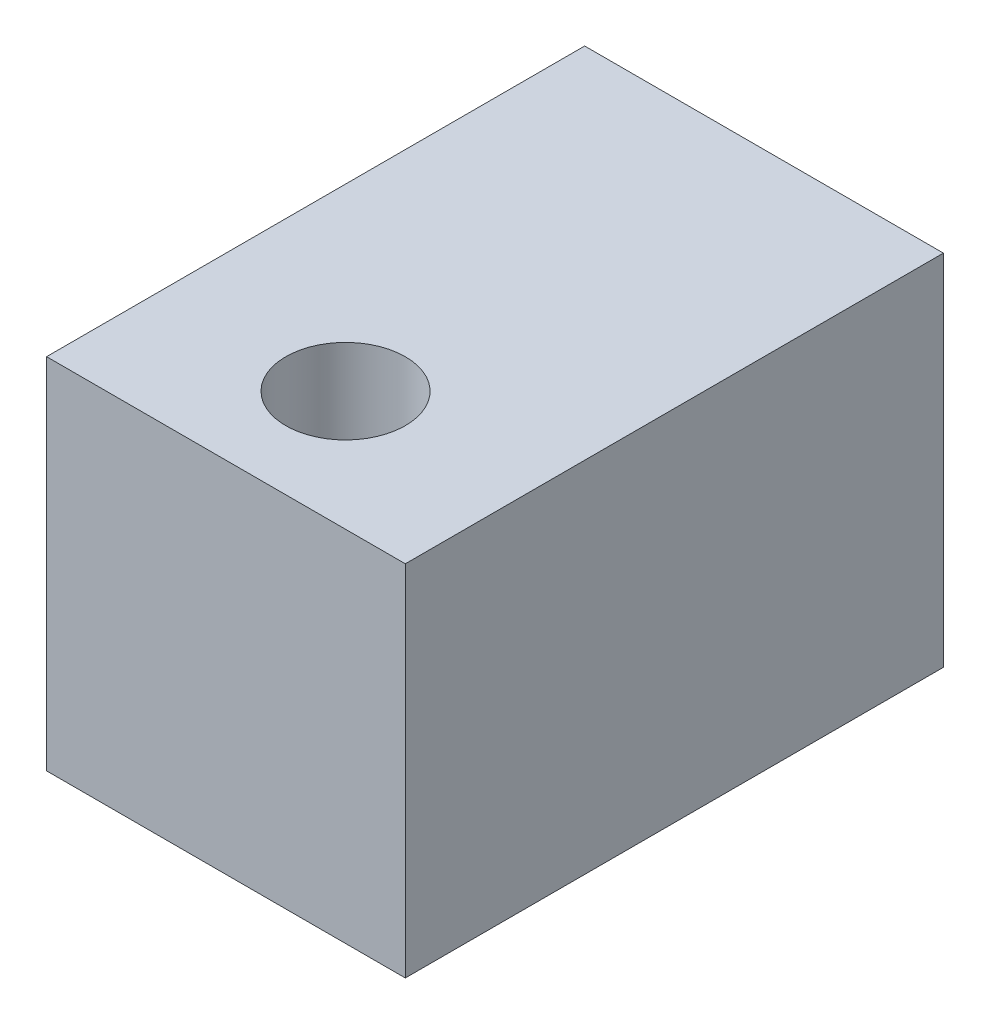
ISO-10303-21;
HEADER;
FILE_DESCRIPTION(('STEP AP214'),'2;1');
FILE_NAME('part.step','',(''),(''),'','','');
FILE_SCHEMA(('AUTOMOTIVE_DESIGN { 1 0 10303 214 1 1 1 1 }'));
ENDSEC;
DATA;
#1=APPLICATION_CONTEXT('core data for automotive mechanical design processes');
#2=APPLICATION_PROTOCOL_DEFINITION('international standard','automotive_design',2000,#1);
#3=PRODUCT_CONTEXT('',#1,'mechanical');
#4=PRODUCT('Part','Part','',(#3));
#5=PRODUCT_RELATED_PRODUCT_CATEGORY('part','',(#4));
#6=PRODUCT_DEFINITION_FORMATION('','',#4);
#7=PRODUCT_DEFINITION_CONTEXT('part definition',#1,'design');
#8=PRODUCT_DEFINITION('design','',#6,#7);
#9=PRODUCT_DEFINITION_SHAPE('','',#8);
#10=(LENGTH_UNIT() NAMED_UNIT(*) SI_UNIT(.MILLI.,.METRE.));
#11=(NAMED_UNIT(*) PLANE_ANGLE_UNIT() SI_UNIT($,.RADIAN.));
#12=(NAMED_UNIT(*) SI_UNIT($,.STERADIAN.) SOLID_ANGLE_UNIT());
#13=UNCERTAINTY_MEASURE_WITH_UNIT(LENGTH_MEASURE(1.E-05),#10,'distance_accuracy_value','');
#14=(GEOMETRIC_REPRESENTATION_CONTEXT(3) GLOBAL_UNCERTAINTY_ASSIGNED_CONTEXT((#13)) GLOBAL_UNIT_ASSIGNED_CONTEXT((#10,
#11,#12)) REPRESENTATION_CONTEXT('',''));
#15=CARTESIAN_POINT('',(0.,0.,0.));
#16=DIRECTION('',(0.,0.,1.));
#17=DIRECTION('',(1.,0.,0.));
#18=AXIS2_PLACEMENT_3D('',#15,#16,#17);
#19=CARTESIAN_POINT('',(0.,0.,0.));
#20=DIRECTION('',(0.,0.,-1.));
#21=DIRECTION('',(-1.,0.,0.));
#22=AXIS2_PLACEMENT_3D('',#19,#20,#21);
#23=PLANE('',#22);
#24=DIRECTION('',(0.,-1.,0.));
#25=VECTOR('',#24,1.);
#26=CARTESIAN_POINT('',(0.,0.,0.));
#27=LINE('',#26,#25);
#28=CARTESIAN_POINT('',(0.,12.,0.));
#29=VERTEX_POINT('',#28);
#30=CARTESIAN_POINT('',(0.,0.,0.));
#31=VERTEX_POINT('',#30);
#32=EDGE_CURVE('E112',#29,#31,#27,.T.);
#33=ORIENTED_EDGE('',*,*,#32,.F.);
#34=DIRECTION('',(-1.,0.,0.));
#35=VECTOR('',#34,1.);
#36=CARTESIAN_POINT('',(0.,12.,0.));
#37=LINE('',#36,#35);
#38=CARTESIAN_POINT('',(12.,12.,0.));
#39=VERTEX_POINT('',#38);
#40=EDGE_CURVE('E63',#39,#29,#37,.T.);
#41=ORIENTED_EDGE('',*,*,#40,.F.);
#42=DIRECTION('',(0.,1.,0.));
#43=VECTOR('',#42,1.);
#44=CARTESIAN_POINT('',(12.,0.,0.));
#45=LINE('',#44,#43);
#46=CARTESIAN_POINT('',(12.,0.,0.));
#47=VERTEX_POINT('',#46);
#48=EDGE_CURVE('E188',#47,#39,#45,.T.);
#49=ORIENTED_EDGE('',*,*,#48,.F.);
#50=DIRECTION('',(1.,0.,0.));
#51=VECTOR('',#50,1.);
#52=CARTESIAN_POINT('',(0.,0.,0.));
#53=LINE('',#52,#51);
#54=EDGE_CURVE('E185',#31,#47,#53,.T.);
#55=ORIENTED_EDGE('',*,*,#54,.F.);
#56=EDGE_LOOP('',(#33,#41,#49,#55));
#57=FACE_BOUND('',#56,.T.);
#58=DIRECTION('',(-1.,0.,0.));
#59=VECTOR('',#58,1.);
#60=CARTESIAN_POINT('',(1.,11.,0.));
#61=LINE('',#60,#59);
#62=CARTESIAN_POINT('',(11.,11.,0.));
#63=VERTEX_POINT('',#62);
#64=CARTESIAN_POINT('',(1.,11.,0.));
#65=VERTEX_POINT('',#64);
#66=EDGE_CURVE('E146',#63,#65,#61,.T.);
#67=ORIENTED_EDGE('',*,*,#66,.T.);
#68=DIRECTION('',(0.,-1.,0.));
#69=VECTOR('',#68,1.);
#70=CARTESIAN_POINT('',(1.,1.,0.));
#71=LINE('',#70,#69);
#72=CARTESIAN_POINT('',(1.,1.,0.));
#73=VERTEX_POINT('',#72);
#74=EDGE_CURVE('E55',#65,#73,#71,.T.);
#75=ORIENTED_EDGE('',*,*,#74,.T.);
#76=DIRECTION('',(1.,0.,0.));
#77=VECTOR('',#76,1.);
#78=CARTESIAN_POINT('',(1.,1.,0.));
#79=LINE('',#78,#77);
#80=CARTESIAN_POINT('',(11.,1.,0.));
#81=VERTEX_POINT('',#80);
#82=EDGE_CURVE('E161',#73,#81,#79,.T.);
#83=ORIENTED_EDGE('',*,*,#82,.T.);
#84=DIRECTION('',(0.,1.,0.));
#85=VECTOR('',#84,1.);
#86=CARTESIAN_POINT('',(11.,1.,0.));
#87=LINE('',#86,#85);
#88=EDGE_CURVE('E165',#81,#63,#87,.T.);
#89=ORIENTED_EDGE('',*,*,#88,.T.);
#90=EDGE_LOOP('',(#67,#75,#83,#89));
#91=FACE_BOUND('',#90,.T.);
#92=ADVANCED_FACE('F39',(#57,#91),#23,.T.);
#93=CARTESIAN_POINT('',(0.,0.,10.));
#94=DIRECTION('',(1.,0.,0.));
#95=DIRECTION('',(0.,0.,-1.));
#96=AXIS2_PLACEMENT_3D('',#93,#94,#95);
#97=PLANE('',#96);
#98=ORIENTED_EDGE('',*,*,#32,.T.);
#99=DIRECTION('',(0.,0.,-1.));
#100=VECTOR('',#99,1.);
#101=CARTESIAN_POINT('',(0.,0.,10.));
#102=LINE('',#101,#100);
#103=CARTESIAN_POINT('',(0.,0.,18.));
#104=VERTEX_POINT('',#103);
#105=EDGE_CURVE('E11',#104,#31,#102,.T.);
#106=ORIENTED_EDGE('',*,*,#105,.F.);
#107=DIRECTION('',(0.,-1.,0.));
#108=VECTOR('',#107,1.);
#109=CARTESIAN_POINT('',(0.,12.,18.));
#110=LINE('',#109,#108);
#111=CARTESIAN_POINT('',(0.,12.,18.));
#112=VERTEX_POINT('',#111);
#113=EDGE_CURVE('E110',#112,#104,#110,.T.);
#114=ORIENTED_EDGE('',*,*,#113,.F.);
#115=DIRECTION('',(0.,0.,-1.));
#116=VECTOR('',#115,1.);
#117=CARTESIAN_POINT('',(0.,12.,10.));
#118=LINE('',#117,#116);
#119=EDGE_CURVE('E193',#112,#29,#118,.T.);
#120=ORIENTED_EDGE('',*,*,#119,.T.);
#121=EDGE_LOOP('',(#98,#106,#114,#120));
#122=FACE_BOUND('',#121,.T.);
#123=ADVANCED_FACE('F41',(#122),#97,.F.);
#124=CARTESIAN_POINT('',(0.,0.,10.));
#125=DIRECTION('',(0.,1.,0.));
#126=DIRECTION('',(0.,0.,1.));
#127=AXIS2_PLACEMENT_3D('',#124,#125,#126);
#128=PLANE('',#127);
#129=CARTESIAN_POINT('',(6.,0.,14.));
#130=DIRECTION('',(0.,-1.,0.));
#131=DIRECTION('',(0.,0.,-1.));
#132=AXIS2_PLACEMENT_3D('',#129,#130,#131);
#133=CIRCLE('',#132,2.);
#134=CARTESIAN_POINT('',(6.,0.,12.));
#135=VERTEX_POINT('',#134);
#136=EDGE_CURVE('E133',#135,#135,#133,.T.);
#137=ORIENTED_EDGE('',*,*,#136,.F.);
#138=EDGE_LOOP('',(#137));
#139=FACE_BOUND('',#138,.T.);
#140=ORIENTED_EDGE('',*,*,#54,.T.);
#141=DIRECTION('',(0.,0.,-1.));
#142=VECTOR('',#141,1.);
#143=CARTESIAN_POINT('',(12.,0.,10.));
#144=LINE('',#143,#142);
#145=CARTESIAN_POINT('',(12.,0.,18.));
#146=VERTEX_POINT('',#145);
#147=EDGE_CURVE('E48',#146,#47,#144,.T.);
#148=ORIENTED_EDGE('',*,*,#147,.F.);
#149=DIRECTION('',(1.,0.,0.));
#150=VECTOR('',#149,1.);
#151=CARTESIAN_POINT('',(0.,0.,18.));
#152=LINE('',#151,#150);
#153=EDGE_CURVE('E115',#104,#146,#152,.T.);
#154=ORIENTED_EDGE('',*,*,#153,.F.);
#155=ORIENTED_EDGE('',*,*,#105,.T.);
#156=EDGE_LOOP('',(#140,#148,#154,#155));
#157=FACE_BOUND('',#156,.T.);
#158=ADVANCED_FACE('F116',(#139,#157),#128,.F.);
#159=CARTESIAN_POINT('',(12.,0.,10.));
#160=DIRECTION('',(-1.,0.,0.));
#161=DIRECTION('',(0.,0.,1.));
#162=AXIS2_PLACEMENT_3D('',#159,#160,#161);
#163=PLANE('',#162);
#164=ORIENTED_EDGE('',*,*,#48,.T.);
#165=DIRECTION('',(0.,0.,-1.));
#166=VECTOR('',#165,1.);
#167=CARTESIAN_POINT('',(12.,12.,10.));
#168=LINE('',#167,#166);
#169=CARTESIAN_POINT('',(12.,12.,18.));
#170=VERTEX_POINT('',#169);
#171=EDGE_CURVE('E196',#170,#39,#168,.T.);
#172=ORIENTED_EDGE('',*,*,#171,.F.);
#173=DIRECTION('',(0.,1.,0.));
#174=VECTOR('',#173,1.);
#175=CARTESIAN_POINT('',(12.,12.,18.));
#176=LINE('',#175,#174);
#177=EDGE_CURVE('E122',#146,#170,#176,.T.);
#178=ORIENTED_EDGE('',*,*,#177,.F.);
#179=ORIENTED_EDGE('',*,*,#147,.T.);
#180=EDGE_LOOP('',(#164,#172,#178,#179));
#181=FACE_BOUND('',#180,.T.);
#182=ADVANCED_FACE('F201',(#181),#163,.F.);
#183=CARTESIAN_POINT('',(0.,12.,10.));
#184=DIRECTION('',(0.,-1.,0.));
#185=DIRECTION('',(0.,0.,-1.));
#186=AXIS2_PLACEMENT_3D('',#183,#184,#185);
#187=PLANE('',#186);
#188=CARTESIAN_POINT('',(6.,12.,14.));
#189=DIRECTION('',(0.,-1.,0.));
#190=DIRECTION('',(0.,0.,-1.));
#191=AXIS2_PLACEMENT_3D('',#188,#189,#190);
#192=CIRCLE('',#191,2.);
#193=CARTESIAN_POINT('',(6.,12.,12.));
#194=VERTEX_POINT('',#193);
#195=EDGE_CURVE('E129',#194,#194,#192,.T.);
#196=ORIENTED_EDGE('',*,*,#195,.T.);
#197=EDGE_LOOP('',(#196));
#198=FACE_BOUND('',#197,.T.);
#199=ORIENTED_EDGE('',*,*,#40,.T.);
#200=ORIENTED_EDGE('',*,*,#119,.F.);
#201=DIRECTION('',(-1.,0.,0.));
#202=VECTOR('',#201,1.);
#203=CARTESIAN_POINT('',(0.,12.,18.));
#204=LINE('',#203,#202);
#205=EDGE_CURVE('E127',#170,#112,#204,.T.);
#206=ORIENTED_EDGE('',*,*,#205,.F.);
#207=ORIENTED_EDGE('',*,*,#171,.T.);
#208=EDGE_LOOP('',(#199,#200,#206,#207));
#209=FACE_BOUND('',#208,.T.);
#210=ADVANCED_FACE('F236',(#198,#209),#187,.F.);
#211=CARTESIAN_POINT('',(1.,1.,10.));
#212=DIRECTION('',(1.,0.,0.));
#213=DIRECTION('',(0.,0.,-1.));
#214=AXIS2_PLACEMENT_3D('',#211,#212,#213);
#215=PLANE('',#214);
#216=ORIENTED_EDGE('',*,*,#74,.F.);
#217=DIRECTION('',(0.,0.,-1.));
#218=VECTOR('',#217,1.);
#219=CARTESIAN_POINT('',(1.,11.,10.));
#220=LINE('',#219,#218);
#221=CARTESIAN_POINT('',(1.,11.,10.));
#222=VERTEX_POINT('',#221);
#223=EDGE_CURVE('E158',#222,#65,#220,.T.);
#224=ORIENTED_EDGE('',*,*,#223,.F.);
#225=DIRECTION('',(0.,-1.,0.));
#226=VECTOR('',#225,1.);
#227=CARTESIAN_POINT('',(1.,1.,10.));
#228=LINE('',#227,#226);
#229=CARTESIAN_POINT('',(1.,1.,10.));
#230=VERTEX_POINT('',#229);
#231=EDGE_CURVE('E141',#222,#230,#228,.T.);
#232=ORIENTED_EDGE('',*,*,#231,.T.);
#233=DIRECTION('',(0.,0.,-1.));
#234=VECTOR('',#233,1.);
#235=CARTESIAN_POINT('',(1.,1.,10.));
#236=LINE('',#235,#234);
#237=EDGE_CURVE('E180',#230,#73,#236,.T.);
#238=ORIENTED_EDGE('',*,*,#237,.T.);
#239=EDGE_LOOP('',(#216,#224,#232,#238));
#240=FACE_BOUND('',#239,.T.);
#241=ADVANCED_FACE('F211',(#240),#215,.T.);
#242=CARTESIAN_POINT('',(1.,1.,10.));
#243=DIRECTION('',(0.,1.,0.));
#244=DIRECTION('',(0.,0.,1.));
#245=AXIS2_PLACEMENT_3D('',#242,#243,#244);
#246=PLANE('',#245);
#247=ORIENTED_EDGE('',*,*,#82,.F.);
#248=ORIENTED_EDGE('',*,*,#237,.F.);
#249=DIRECTION('',(1.,0.,0.));
#250=VECTOR('',#249,1.);
#251=CARTESIAN_POINT('',(1.,1.,10.));
#252=LINE('',#251,#250);
#253=CARTESIAN_POINT('',(11.,1.,10.));
#254=VERTEX_POINT('',#253);
#255=EDGE_CURVE('E145',#230,#254,#252,.T.);
#256=ORIENTED_EDGE('',*,*,#255,.T.);
#257=DIRECTION('',(0.,0.,-1.));
#258=VECTOR('',#257,1.);
#259=CARTESIAN_POINT('',(11.,1.,10.));
#260=LINE('',#259,#258);
#261=EDGE_CURVE('E177',#254,#81,#260,.T.);
#262=ORIENTED_EDGE('',*,*,#261,.T.);
#263=EDGE_LOOP('',(#247,#248,#256,#262));
#264=FACE_BOUND('',#263,.T.);
#265=ADVANCED_FACE('F215',(#264),#246,.T.);
#266=CARTESIAN_POINT('',(11.,1.,10.));
#267=DIRECTION('',(-1.,0.,0.));
#268=DIRECTION('',(0.,0.,1.));
#269=AXIS2_PLACEMENT_3D('',#266,#267,#268);
#270=PLANE('',#269);
#271=ORIENTED_EDGE('',*,*,#88,.F.);
#272=ORIENTED_EDGE('',*,*,#261,.F.);
#273=DIRECTION('',(0.,1.,0.));
#274=VECTOR('',#273,1.);
#275=CARTESIAN_POINT('',(11.,1.,10.));
#276=LINE('',#275,#274);
#277=CARTESIAN_POINT('',(11.,11.,10.));
#278=VERTEX_POINT('',#277);
#279=EDGE_CURVE('E150',#254,#278,#276,.T.);
#280=ORIENTED_EDGE('',*,*,#279,.T.);
#281=DIRECTION('',(0.,0.,-1.));
#282=VECTOR('',#281,1.);
#283=CARTESIAN_POINT('',(11.,11.,10.));
#284=LINE('',#283,#282);
#285=EDGE_CURVE('E174',#278,#63,#284,.T.);
#286=ORIENTED_EDGE('',*,*,#285,.T.);
#287=EDGE_LOOP('',(#271,#272,#280,#286));
#288=FACE_BOUND('',#287,.T.);
#289=ADVANCED_FACE('F218',(#288),#270,.T.);
#290=CARTESIAN_POINT('',(1.,11.,10.));
#291=DIRECTION('',(0.,-1.,0.));
#292=DIRECTION('',(0.,0.,-1.));
#293=AXIS2_PLACEMENT_3D('',#290,#291,#292);
#294=PLANE('',#293);
#295=ORIENTED_EDGE('',*,*,#66,.F.);
#296=ORIENTED_EDGE('',*,*,#285,.F.);
#297=DIRECTION('',(-1.,0.,0.));
#298=VECTOR('',#297,1.);
#299=CARTESIAN_POINT('',(1.,11.,10.));
#300=LINE('',#299,#298);
#301=EDGE_CURVE('E154',#278,#222,#300,.T.);
#302=ORIENTED_EDGE('',*,*,#301,.T.);
#303=ORIENTED_EDGE('',*,*,#223,.T.);
#304=EDGE_LOOP('',(#295,#296,#302,#303));
#305=FACE_BOUND('',#304,.T.);
#306=ADVANCED_FACE('F210',(#305),#294,.T.);
#307=CARTESIAN_POINT('',(0.,0.,10.));
#308=DIRECTION('',(0.,0.,1.));
#309=DIRECTION('',(1.,0.,0.));
#310=AXIS2_PLACEMENT_3D('',#307,#308,#309);
#311=PLANE('',#310);
#312=ORIENTED_EDGE('',*,*,#231,.F.);
#313=ORIENTED_EDGE('',*,*,#301,.F.);
#314=ORIENTED_EDGE('',*,*,#279,.F.);
#315=ORIENTED_EDGE('',*,*,#255,.F.);
#316=EDGE_LOOP('',(#312,#313,#314,#315));
#317=FACE_BOUND('',#316,.T.);
#318=ADVANCED_FACE('F219',(#317),#311,.F.);
#319=CARTESIAN_POINT('',(0.,0.,18.));
#320=DIRECTION('',(0.,0.,1.));
#321=DIRECTION('',(1.,0.,0.));
#322=AXIS2_PLACEMENT_3D('',#319,#320,#321);
#323=PLANE('',#322);
#324=ORIENTED_EDGE('',*,*,#113,.T.);
#325=ORIENTED_EDGE('',*,*,#153,.T.);
#326=ORIENTED_EDGE('',*,*,#177,.T.);
#327=ORIENTED_EDGE('',*,*,#205,.T.);
#328=EDGE_LOOP('',(#324,#325,#326,#327));
#329=FACE_BOUND('',#328,.T.);
#330=ADVANCED_FACE('F125',(#329),#323,.T.);
#331=CARTESIAN_POINT('',(6.,12.,14.));
#332=DIRECTION('',(0.,-1.,0.));
#333=DIRECTION('',(0.,0.,-1.));
#334=AXIS2_PLACEMENT_3D('',#331,#332,#333);
#335=CYLINDRICAL_SURFACE('',#334,2.);
#336=ORIENTED_EDGE('',*,*,#195,.F.);
#337=EDGE_LOOP('',(#336));
#338=FACE_BOUND('',#337,.T.);
#339=ORIENTED_EDGE('',*,*,#136,.T.);
#340=EDGE_LOOP('',(#339));
#341=FACE_BOUND('',#340,.T.);
#342=ADVANCED_FACE('F226',(#338,#341),#335,.F.);
#343=CLOSED_SHELL('',(#92,#123,#158,#182,#210,#241,#265,#289,#306,#318,#330,#342));
#344=MANIFOLD_SOLID_BREP('B2',#343);
#345=ADVANCED_BREP_SHAPE_REPRESENTATION('',(#18,#344),#14);
#346=SHAPE_DEFINITION_REPRESENTATION(#9,#345);
ENDSEC;
END-ISO-10303-21;
